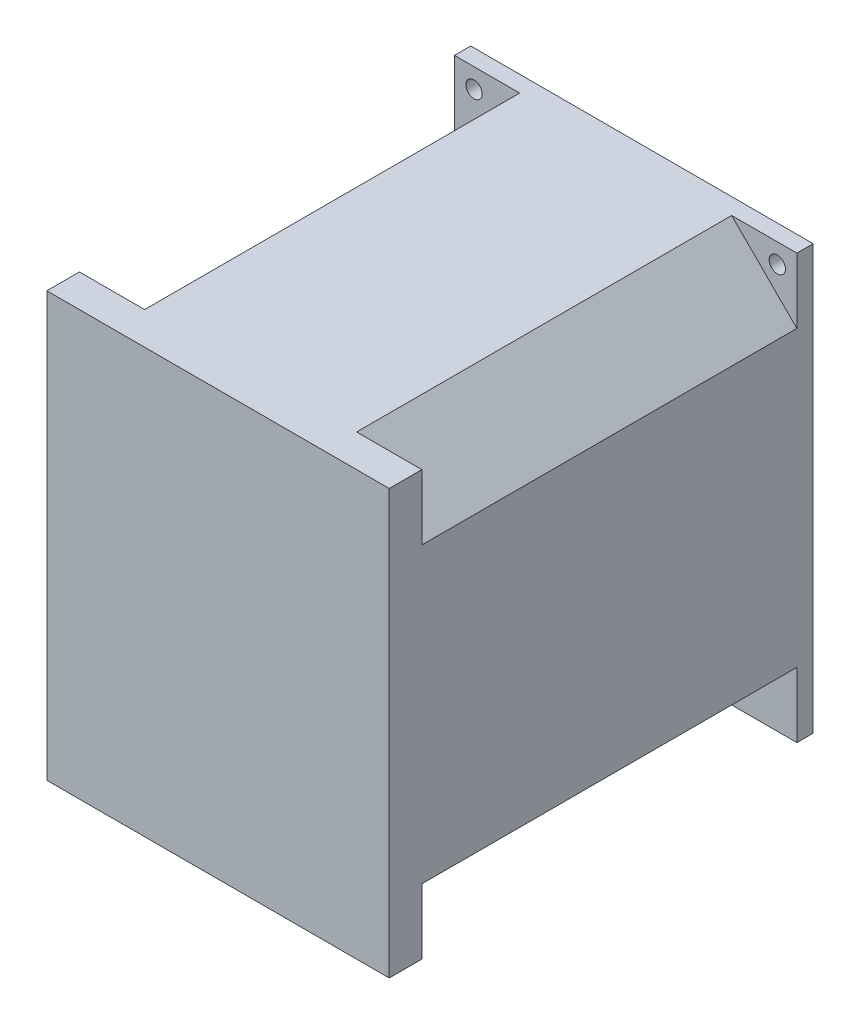
ISO-10303-21;
HEADER;
FILE_DESCRIPTION(('STEP AP214'),'2;1');
FILE_NAME('part.step','',(''),(''),'','','');
FILE_SCHEMA(('AUTOMOTIVE_DESIGN { 1 0 10303 214 1 1 1 1 }'));
ENDSEC;
DATA;
#1=APPLICATION_CONTEXT('core data for automotive mechanical design processes');
#2=APPLICATION_PROTOCOL_DEFINITION('international standard','automotive_design',2000,#1);
#3=PRODUCT_CONTEXT('',#1,'mechanical');
#4=PRODUCT('Part','Part','',(#3));
#5=PRODUCT_RELATED_PRODUCT_CATEGORY('part','',(#4));
#6=PRODUCT_DEFINITION_FORMATION('','',#4);
#7=PRODUCT_DEFINITION_CONTEXT('part definition',#1,'design');
#8=PRODUCT_DEFINITION('design','',#6,#7);
#9=PRODUCT_DEFINITION_SHAPE('','',#8);
#10=(LENGTH_UNIT() NAMED_UNIT(*) SI_UNIT(.MILLI.,.METRE.));
#11=(NAMED_UNIT(*) PLANE_ANGLE_UNIT() SI_UNIT($,.RADIAN.));
#12=(NAMED_UNIT(*) SI_UNIT($,.STERADIAN.) SOLID_ANGLE_UNIT());
#13=UNCERTAINTY_MEASURE_WITH_UNIT(LENGTH_MEASURE(1.E-05),#10,'distance_accuracy_value','');
#14=(GEOMETRIC_REPRESENTATION_CONTEXT(3) GLOBAL_UNCERTAINTY_ASSIGNED_CONTEXT((#13)) GLOBAL_UNIT_ASSIGNED_CONTEXT((#10,
#11,#12)) REPRESENTATION_CONTEXT('',''));
#15=CARTESIAN_POINT('',(0.,0.,0.));
#16=DIRECTION('',(0.,0.,1.));
#17=DIRECTION('',(1.,0.,0.));
#18=AXIS2_PLACEMENT_3D('',#15,#16,#17);
#19=CARTESIAN_POINT('',(105.,0.,0.));
#20=DIRECTION('',(0.,1.,0.));
#21=DIRECTION('',(0.,0.,1.));
#22=AXIS2_PLACEMENT_3D('',#19,#20,#21);
#23=PLANE('',#22);
#24=DIRECTION('',(1.,0.,0.));
#25=VECTOR('',#24,1.);
#26=CARTESIAN_POINT('',(85.,0.,-125.));
#27=LINE('',#26,#25);
#28=CARTESIAN_POINT('',(85.,0.,-125.));
#29=VERTEX_POINT('',#28);
#30=CARTESIAN_POINT('',(105.,0.,-125.));
#31=VERTEX_POINT('',#30);
#32=EDGE_CURVE('E222',#29,#31,#27,.T.);
#33=ORIENTED_EDGE('',*,*,#32,.F.);
#34=DIRECTION('',(0.,0.,1.));
#35=VECTOR('',#34,1.);
#36=CARTESIAN_POINT('',(85.,0.,-125.));
#37=LINE('',#36,#35);
#38=CARTESIAN_POINT('',(85.,0.,-10.));
#39=VERTEX_POINT('',#38);
#40=EDGE_CURVE('E159',#29,#39,#37,.T.);
#41=ORIENTED_EDGE('',*,*,#40,.T.);
#42=DIRECTION('',(1.,0.,0.));
#43=VECTOR('',#42,1.);
#44=CARTESIAN_POINT('',(85.,0.,-10.));
#45=LINE('',#44,#43);
#46=CARTESIAN_POINT('',(105.,0.,-10.));
#47=VERTEX_POINT('',#46);
#48=EDGE_CURVE('E149',#39,#47,#45,.T.);
#49=ORIENTED_EDGE('',*,*,#48,.T.);
#50=DIRECTION('',(0.,0.,-1.));
#51=VECTOR('',#50,1.);
#52=CARTESIAN_POINT('',(105.,0.,0.));
#53=LINE('',#52,#51);
#54=CARTESIAN_POINT('',(105.,0.,0.));
#55=VERTEX_POINT('',#54);
#56=EDGE_CURVE('E157',#55,#47,#53,.T.);
#57=ORIENTED_EDGE('',*,*,#56,.F.);
#58=DIRECTION('',(-1.,0.,0.));
#59=VECTOR('',#58,1.);
#60=CARTESIAN_POINT('',(105.,0.,0.));
#61=LINE('',#60,#59);
#62=CARTESIAN_POINT('',(0.,0.,0.));
#63=VERTEX_POINT('',#62);
#64=EDGE_CURVE('E11',#55,#63,#61,.T.);
#65=ORIENTED_EDGE('',*,*,#64,.T.);
#66=DIRECTION('',(0.,0.,-1.));
#67=VECTOR('',#66,1.);
#68=CARTESIAN_POINT('',(0.,0.,0.));
#69=LINE('',#68,#67);
#70=CARTESIAN_POINT('',(0.,0.,-10.));
#71=VERTEX_POINT('',#70);
#72=EDGE_CURVE('E203',#63,#71,#69,.T.);
#73=ORIENTED_EDGE('',*,*,#72,.T.);
#74=DIRECTION('',(1.,0.,0.));
#75=VECTOR('',#74,1.);
#76=CARTESIAN_POINT('',(0.,0.,-10.));
#77=LINE('',#76,#75);
#78=CARTESIAN_POINT('',(20.,0.,-10.));
#79=VERTEX_POINT('',#78);
#80=EDGE_CURVE('E270',#71,#79,#77,.T.);
#81=ORIENTED_EDGE('',*,*,#80,.T.);
#82=DIRECTION('',(0.,0.,1.));
#83=VECTOR('',#82,1.);
#84=CARTESIAN_POINT('',(20.,0.,-125.));
#85=LINE('',#84,#83);
#86=CARTESIAN_POINT('',(20.,0.,-125.));
#87=VERTEX_POINT('',#86);
#88=EDGE_CURVE('E283',#87,#79,#85,.T.);
#89=ORIENTED_EDGE('',*,*,#88,.F.);
#90=DIRECTION('',(1.,0.,0.));
#91=VECTOR('',#90,1.);
#92=CARTESIAN_POINT('',(0.,0.,-125.));
#93=LINE('',#92,#91);
#94=CARTESIAN_POINT('',(0.,0.,-125.));
#95=VERTEX_POINT('',#94);
#96=EDGE_CURVE('E278',#95,#87,#93,.T.);
#97=ORIENTED_EDGE('',*,*,#96,.F.);
#98=CARTESIAN_POINT('',(0.,0.,-130.));
#99=VERTEX_POINT('',#98);
#100=EDGE_CURVE('E198',#95,#99,#69,.T.);
#101=ORIENTED_EDGE('',*,*,#100,.T.);
#102=DIRECTION('',(-1.,0.,0.));
#103=VECTOR('',#102,1.);
#104=CARTESIAN_POINT('',(105.,0.,-130.));
#105=LINE('',#104,#103);
#106=CARTESIAN_POINT('',(105.,0.,-130.));
#107=VERTEX_POINT('',#106);
#108=EDGE_CURVE('E41',#107,#99,#105,.T.);
#109=ORIENTED_EDGE('',*,*,#108,.F.);
#110=EDGE_CURVE('E168',#31,#107,#53,.T.);
#111=ORIENTED_EDGE('',*,*,#110,.F.);
#112=EDGE_LOOP('',(#33,#41,#49,#57,#65,#73,#81,#89,#97,#101,#109,#111));
#113=FACE_BOUND('',#112,.T.);
#114=ADVANCED_FACE('F33',(#113),#23,.F.);
#115=CARTESIAN_POINT('',(105.,130.,0.));
#116=DIRECTION('',(-1.,0.,0.));
#117=DIRECTION('',(0.,0.,1.));
#118=AXIS2_PLACEMENT_3D('',#115,#116,#117);
#119=PLANE('',#118);
#120=DIRECTION('',(0.,1.,0.));
#121=VECTOR('',#120,1.);
#122=CARTESIAN_POINT('',(105.,0.,-125.));
#123=LINE('',#122,#121);
#124=CARTESIAN_POINT('',(105.,20.,-125.));
#125=VERTEX_POINT('',#124);
#126=EDGE_CURVE('E221',#31,#125,#123,.T.);
#127=ORIENTED_EDGE('',*,*,#126,.F.);
#128=ORIENTED_EDGE('',*,*,#110,.T.);
#129=DIRECTION('',(0.,1.,0.));
#130=VECTOR('',#129,1.);
#131=CARTESIAN_POINT('',(105.,0.,-130.));
#132=LINE('',#131,#130);
#133=CARTESIAN_POINT('',(105.,130.,-130.));
#134=VERTEX_POINT('',#133);
#135=EDGE_CURVE('E167',#107,#134,#132,.T.);
#136=ORIENTED_EDGE('',*,*,#135,.T.);
#137=DIRECTION('',(0.,0.,1.));
#138=VECTOR('',#137,1.);
#139=CARTESIAN_POINT('',(105.,130.,0.));
#140=LINE('',#139,#138);
#141=CARTESIAN_POINT('',(105.,130.,-125.));
#142=VERTEX_POINT('',#141);
#143=EDGE_CURVE('E175',#134,#142,#140,.T.);
#144=ORIENTED_EDGE('',*,*,#143,.T.);
#145=DIRECTION('',(0.,1.,0.));
#146=VECTOR('',#145,1.);
#147=CARTESIAN_POINT('',(105.,130.,-125.));
#148=LINE('',#147,#146);
#149=CARTESIAN_POINT('',(105.,110.,-125.));
#150=VERTEX_POINT('',#149);
#151=EDGE_CURVE('E220',#150,#142,#148,.T.);
#152=ORIENTED_EDGE('',*,*,#151,.F.);
#153=DIRECTION('',(0.,0.,1.));
#154=VECTOR('',#153,1.);
#155=CARTESIAN_POINT('',(105.,110.,-125.));
#156=LINE('',#155,#154);
#157=CARTESIAN_POINT('',(105.,110.,-10.));
#158=VERTEX_POINT('',#157);
#159=EDGE_CURVE('E245',#150,#158,#156,.T.);
#160=ORIENTED_EDGE('',*,*,#159,.T.);
#161=DIRECTION('',(0.,1.,0.));
#162=VECTOR('',#161,1.);
#163=CARTESIAN_POINT('',(105.,130.,-10.));
#164=LINE('',#163,#162);
#165=CARTESIAN_POINT('',(105.,130.,-10.));
#166=VERTEX_POINT('',#165);
#167=EDGE_CURVE('E237',#158,#166,#164,.T.);
#168=ORIENTED_EDGE('',*,*,#167,.T.);
#169=CARTESIAN_POINT('',(105.,130.,0.));
#170=VERTEX_POINT('',#169);
#171=EDGE_CURVE('E170',#166,#170,#140,.T.);
#172=ORIENTED_EDGE('',*,*,#171,.T.);
#173=DIRECTION('',(0.,-1.,0.));
#174=VECTOR('',#173,1.);
#175=CARTESIAN_POINT('',(105.,0.,0.));
#176=LINE('',#175,#174);
#177=EDGE_CURVE('E165',#170,#55,#176,.T.);
#178=ORIENTED_EDGE('',*,*,#177,.T.);
#179=ORIENTED_EDGE('',*,*,#56,.T.);
#180=DIRECTION('',(0.,1.,0.));
#181=VECTOR('',#180,1.);
#182=CARTESIAN_POINT('',(105.,0.,-10.));
#183=LINE('',#182,#181);
#184=CARTESIAN_POINT('',(105.,20.,-10.));
#185=VERTEX_POINT('',#184);
#186=EDGE_CURVE('E146',#47,#185,#183,.T.);
#187=ORIENTED_EDGE('',*,*,#186,.T.);
#188=DIRECTION('',(0.,0.,1.));
#189=VECTOR('',#188,1.);
#190=CARTESIAN_POINT('',(105.,20.,-125.));
#191=LINE('',#190,#189);
#192=EDGE_CURVE('E231',#125,#185,#191,.T.);
#193=ORIENTED_EDGE('',*,*,#192,.F.);
#194=EDGE_LOOP('',(#127,#128,#136,#144,#152,#160,#168,#172,#178,#179,#187,#193));
#195=FACE_BOUND('',#194,.T.);
#196=ADVANCED_FACE('F163',(#195),#119,.F.);
#197=CARTESIAN_POINT('',(0.,130.,0.));
#198=DIRECTION('',(-1.,0.,0.));
#199=DIRECTION('',(0.,0.,1.));
#200=AXIS2_PLACEMENT_3D('',#197,#198,#199);
#201=PLANE('',#200);
#202=DIRECTION('',(0.,0.,1.));
#203=VECTOR('',#202,1.);
#204=CARTESIAN_POINT('',(0.,110.,-125.));
#205=LINE('',#204,#203);
#206=CARTESIAN_POINT('',(0.,110.,-125.));
#207=VERTEX_POINT('',#206);
#208=CARTESIAN_POINT('',(0.,110.,-10.));
#209=VERTEX_POINT('',#208);
#210=EDGE_CURVE('E263',#207,#209,#205,.T.);
#211=ORIENTED_EDGE('',*,*,#210,.F.);
#212=DIRECTION('',(0.,-1.,0.));
#213=VECTOR('',#212,1.);
#214=CARTESIAN_POINT('',(0.,130.,-125.));
#215=LINE('',#214,#213);
#216=CARTESIAN_POINT('',(0.,130.,-125.));
#217=VERTEX_POINT('',#216);
#218=EDGE_CURVE('E258',#217,#207,#215,.T.);
#219=ORIENTED_EDGE('',*,*,#218,.F.);
#220=DIRECTION('',(0.,0.,1.));
#221=VECTOR('',#220,1.);
#222=CARTESIAN_POINT('',(0.,130.,0.));
#223=LINE('',#222,#221);
#224=CARTESIAN_POINT('',(0.,130.,-130.));
#225=VERTEX_POINT('',#224);
#226=EDGE_CURVE('E201',#225,#217,#223,.T.);
#227=ORIENTED_EDGE('',*,*,#226,.F.);
#228=DIRECTION('',(0.,1.,0.));
#229=VECTOR('',#228,1.);
#230=CARTESIAN_POINT('',(0.,0.,-130.));
#231=LINE('',#230,#229);
#232=EDGE_CURVE('E190',#99,#225,#231,.T.);
#233=ORIENTED_EDGE('',*,*,#232,.F.);
#234=ORIENTED_EDGE('',*,*,#100,.F.);
#235=DIRECTION('',(0.,-1.,0.));
#236=VECTOR('',#235,1.);
#237=CARTESIAN_POINT('',(0.,20.,-125.));
#238=LINE('',#237,#236);
#239=CARTESIAN_POINT('',(0.,20.,-125.));
#240=VERTEX_POINT('',#239);
#241=EDGE_CURVE('E276',#240,#95,#238,.T.);
#242=ORIENTED_EDGE('',*,*,#241,.F.);
#243=DIRECTION('',(0.,0.,1.));
#244=VECTOR('',#243,1.);
#245=CARTESIAN_POINT('',(0.,20.,-125.));
#246=LINE('',#245,#244);
#247=CARTESIAN_POINT('',(0.,20.,-10.));
#248=VERTEX_POINT('',#247);
#249=EDGE_CURVE('E284',#240,#248,#246,.T.);
#250=ORIENTED_EDGE('',*,*,#249,.T.);
#251=DIRECTION('',(0.,-1.,0.));
#252=VECTOR('',#251,1.);
#253=CARTESIAN_POINT('',(0.,20.,-10.));
#254=LINE('',#253,#252);
#255=EDGE_CURVE('E266',#248,#71,#254,.T.);
#256=ORIENTED_EDGE('',*,*,#255,.T.);
#257=ORIENTED_EDGE('',*,*,#72,.F.);
#258=DIRECTION('',(0.,-1.,0.));
#259=VECTOR('',#258,1.);
#260=CARTESIAN_POINT('',(0.,0.,0.));
#261=LINE('',#260,#259);
#262=CARTESIAN_POINT('',(0.,130.,0.));
#263=VERTEX_POINT('',#262);
#264=EDGE_CURVE('E287',#263,#63,#261,.T.);
#265=ORIENTED_EDGE('',*,*,#264,.F.);
#266=CARTESIAN_POINT('',(0.,130.,-10.));
#267=VERTEX_POINT('',#266);
#268=EDGE_CURVE('E202',#267,#263,#223,.T.);
#269=ORIENTED_EDGE('',*,*,#268,.F.);
#270=DIRECTION('',(0.,-1.,0.));
#271=VECTOR('',#270,1.);
#272=CARTESIAN_POINT('',(0.,130.,-10.));
#273=LINE('',#272,#271);
#274=EDGE_CURVE('E251',#267,#209,#273,.T.);
#275=ORIENTED_EDGE('',*,*,#274,.T.);
#276=EDGE_LOOP('',(#211,#219,#227,#233,#234,#242,#250,#256,#257,#265,#269,#275));
#277=FACE_BOUND('',#276,.T.);
#278=ADVANCED_FACE('F196',(#277),#201,.T.);
#279=CARTESIAN_POINT('',(105.,130.,0.));
#280=DIRECTION('',(0.,-1.,0.));
#281=DIRECTION('',(0.,0.,-1.));
#282=AXIS2_PLACEMENT_3D('',#279,#280,#281);
#283=PLANE('',#282);
#284=DIRECTION('',(0.,0.,1.));
#285=VECTOR('',#284,1.);
#286=CARTESIAN_POINT('',(85.,130.,-125.));
#287=LINE('',#286,#285);
#288=CARTESIAN_POINT('',(85.,130.,-125.));
#289=VERTEX_POINT('',#288);
#290=CARTESIAN_POINT('',(85.,130.,-10.));
#291=VERTEX_POINT('',#290);
#292=EDGE_CURVE('E244',#289,#291,#287,.T.);
#293=ORIENTED_EDGE('',*,*,#292,.F.);
#294=DIRECTION('',(-1.,0.,0.));
#295=VECTOR('',#294,1.);
#296=CARTESIAN_POINT('',(85.,130.,-125.));
#297=LINE('',#296,#295);
#298=EDGE_CURVE('E217',#142,#289,#297,.T.);
#299=ORIENTED_EDGE('',*,*,#298,.F.);
#300=ORIENTED_EDGE('',*,*,#143,.F.);
#301=DIRECTION('',(-1.,0.,0.));
#302=VECTOR('',#301,1.);
#303=CARTESIAN_POINT('',(105.,130.,-130.));
#304=LINE('',#303,#302);
#305=EDGE_CURVE('E181',#134,#225,#304,.T.);
#306=ORIENTED_EDGE('',*,*,#305,.T.);
#307=ORIENTED_EDGE('',*,*,#226,.T.);
#308=DIRECTION('',(-1.,0.,0.));
#309=VECTOR('',#308,1.);
#310=CARTESIAN_POINT('',(20.,130.,-125.));
#311=LINE('',#310,#309);
#312=CARTESIAN_POINT('',(20.,130.,-125.));
#313=VERTEX_POINT('',#312);
#314=EDGE_CURVE('E213',#313,#217,#311,.T.);
#315=ORIENTED_EDGE('',*,*,#314,.F.);
#316=DIRECTION('',(0.,0.,1.));
#317=VECTOR('',#316,1.);
#318=CARTESIAN_POINT('',(20.,130.,-125.));
#319=LINE('',#318,#317);
#320=CARTESIAN_POINT('',(20.,130.,-10.));
#321=VERTEX_POINT('',#320);
#322=EDGE_CURVE('E264',#313,#321,#319,.T.);
#323=ORIENTED_EDGE('',*,*,#322,.T.);
#324=DIRECTION('',(-1.,0.,0.));
#325=VECTOR('',#324,1.);
#326=CARTESIAN_POINT('',(20.,130.,-10.));
#327=LINE('',#326,#325);
#328=EDGE_CURVE('E247',#321,#267,#327,.T.);
#329=ORIENTED_EDGE('',*,*,#328,.T.);
#330=ORIENTED_EDGE('',*,*,#268,.T.);
#331=DIRECTION('',(-1.,0.,0.));
#332=VECTOR('',#331,1.);
#333=CARTESIAN_POINT('',(105.,130.,0.));
#334=LINE('',#333,#332);
#335=EDGE_CURVE('E178',#170,#263,#334,.T.);
#336=ORIENTED_EDGE('',*,*,#335,.F.);
#337=ORIENTED_EDGE('',*,*,#171,.F.);
#338=DIRECTION('',(-1.,0.,0.));
#339=VECTOR('',#338,1.);
#340=CARTESIAN_POINT('',(85.,130.,-10.));
#341=LINE('',#340,#339);
#342=EDGE_CURVE('E56',#166,#291,#341,.T.);
#343=ORIENTED_EDGE('',*,*,#342,.T.);
#344=EDGE_LOOP('',(#293,#299,#300,#306,#307,#315,#323,#329,#330,#336,#337,#343));
#345=FACE_BOUND('',#344,.T.);
#346=ADVANCED_FACE('F211',(#345),#283,.F.);
#347=CARTESIAN_POINT('',(105.,0.,0.));
#348=DIRECTION('',(0.,0.,-1.));
#349=DIRECTION('',(-1.,0.,0.));
#350=AXIS2_PLACEMENT_3D('',#347,#348,#349);
#351=PLANE('',#350);
#352=ORIENTED_EDGE('',*,*,#264,.T.);
#353=ORIENTED_EDGE('',*,*,#64,.F.);
#354=ORIENTED_EDGE('',*,*,#177,.F.);
#355=ORIENTED_EDGE('',*,*,#335,.T.);
#356=EDGE_LOOP('',(#352,#353,#354,#355));
#357=FACE_BOUND('',#356,.T.);
#358=ADVANCED_FACE('F35',(#357),#351,.F.);
#359=CARTESIAN_POINT('',(105.,0.,-130.));
#360=DIRECTION('',(0.,0.,1.));
#361=DIRECTION('',(1.,0.,0.));
#362=AXIS2_PLACEMENT_3D('',#359,#360,#361);
#363=PLANE('',#362);
#364=CARTESIAN_POINT('',(99.,124.,-130.));
#365=DIRECTION('',(0.,0.,-1.));
#366=DIRECTION('',(-1.,0.,0.));
#367=AXIS2_PLACEMENT_3D('',#364,#365,#366);
#368=CIRCLE('',#367,2.50000000000001);
#369=CARTESIAN_POINT('',(96.5,124.,-130.));
#370=VERTEX_POINT('',#369);
#371=EDGE_CURVE('E444',#370,#370,#368,.T.);
#372=ORIENTED_EDGE('',*,*,#371,.F.);
#373=EDGE_LOOP('',(#372));
#374=FACE_BOUND('',#373,.T.);
#375=CARTESIAN_POINT('',(6.,124.,-130.));
#376=DIRECTION('',(0.,0.,-1.));
#377=DIRECTION('',(-1.,0.,0.));
#378=AXIS2_PLACEMENT_3D('',#375,#376,#377);
#379=CIRCLE('',#378,2.50000000000001);
#380=CARTESIAN_POINT('',(3.49999999999999,124.,-130.));
#381=VERTEX_POINT('',#380);
#382=EDGE_CURVE('E446',#381,#381,#379,.T.);
#383=ORIENTED_EDGE('',*,*,#382,.F.);
#384=EDGE_LOOP('',(#383));
#385=FACE_BOUND('',#384,.T.);
#386=ORIENTED_EDGE('',*,*,#232,.T.);
#387=ORIENTED_EDGE('',*,*,#305,.F.);
#388=ORIENTED_EDGE('',*,*,#135,.F.);
#389=ORIENTED_EDGE('',*,*,#108,.T.);
#390=EDGE_LOOP('',(#386,#387,#388,#389));
#391=FACE_BOUND('',#390,.T.);
#392=ADVANCED_FACE('F188',(#374,#385,#391),#363,.F.);
#393=CARTESIAN_POINT('',(20.,0.,-125.));
#394=DIRECTION('',(0.707106781186547,0.707106781186547,0.));
#395=DIRECTION('',(-0.707106781186548,0.707106781186548,0.));
#396=AXIS2_PLACEMENT_3D('',#393,#394,#395);
#397=PLANE('',#396);
#398=DIRECTION('',(-0.707106781186548,0.707106781186548,0.));
#399=VECTOR('',#398,1.);
#400=CARTESIAN_POINT('',(20.,0.,-10.));
#401=LINE('',#400,#399);
#402=EDGE_CURVE('E273',#79,#248,#401,.T.);
#403=ORIENTED_EDGE('',*,*,#402,.T.);
#404=ORIENTED_EDGE('',*,*,#249,.F.);
#405=DIRECTION('',(-0.707106781186548,0.707106781186548,0.));
#406=VECTOR('',#405,1.);
#407=CARTESIAN_POINT('',(20.,0.,-125.));
#408=LINE('',#407,#406);
#409=EDGE_CURVE('E280',#87,#240,#408,.T.);
#410=ORIENTED_EDGE('',*,*,#409,.F.);
#411=ORIENTED_EDGE('',*,*,#88,.T.);
#412=EDGE_LOOP('',(#403,#404,#410,#411));
#413=FACE_BOUND('',#412,.T.);
#414=ADVANCED_FACE('F297',(#413),#397,.F.);
#415=CARTESIAN_POINT('',(0.,0.,-125.));
#416=DIRECTION('',(0.,0.,1.));
#417=DIRECTION('',(1.,0.,0.));
#418=AXIS2_PLACEMENT_3D('',#415,#416,#417);
#419=PLANE('',#418);
#420=ORIENTED_EDGE('',*,*,#241,.T.);
#421=ORIENTED_EDGE('',*,*,#96,.T.);
#422=ORIENTED_EDGE('',*,*,#409,.T.);
#423=EDGE_LOOP('',(#420,#421,#422));
#424=FACE_BOUND('',#423,.T.);
#425=ADVANCED_FACE('F295',(#424),#419,.T.);
#426=CARTESIAN_POINT('',(0.,0.,-10.));
#427=DIRECTION('',(0.,0.,1.));
#428=DIRECTION('',(1.,0.,0.));
#429=AXIS2_PLACEMENT_3D('',#426,#427,#428);
#430=PLANE('',#429);
#431=ORIENTED_EDGE('',*,*,#255,.F.);
#432=ORIENTED_EDGE('',*,*,#402,.F.);
#433=ORIENTED_EDGE('',*,*,#80,.F.);
#434=EDGE_LOOP('',(#431,#432,#433));
#435=FACE_BOUND('',#434,.T.);
#436=ADVANCED_FACE('F320',(#435),#430,.F.);
#437=CARTESIAN_POINT('',(0.,110.,-125.));
#438=DIRECTION('',(0.707106781186547,-0.707106781186548,0.));
#439=DIRECTION('',(0.707106781186548,0.707106781186547,0.));
#440=AXIS2_PLACEMENT_3D('',#437,#438,#439);
#441=PLANE('',#440);
#442=DIRECTION('',(0.707106781186548,0.707106781186547,0.));
#443=VECTOR('',#442,1.);
#444=CARTESIAN_POINT('',(0.,110.,-10.));
#445=LINE('',#444,#443);
#446=EDGE_CURVE('E254',#209,#321,#445,.T.);
#447=ORIENTED_EDGE('',*,*,#446,.T.);
#448=ORIENTED_EDGE('',*,*,#322,.F.);
#449=DIRECTION('',(0.707106781186548,0.707106781186547,0.));
#450=VECTOR('',#449,1.);
#451=CARTESIAN_POINT('',(0.,110.,-125.));
#452=LINE('',#451,#450);
#453=EDGE_CURVE('E260',#207,#313,#452,.T.);
#454=ORIENTED_EDGE('',*,*,#453,.F.);
#455=ORIENTED_EDGE('',*,*,#210,.T.);
#456=EDGE_LOOP('',(#447,#448,#454,#455));
#457=FACE_BOUND('',#456,.T.);
#458=ADVANCED_FACE('F307',(#457),#441,.F.);
#459=CARTESIAN_POINT('',(0.,130.,-125.));
#460=DIRECTION('',(0.,0.,1.));
#461=DIRECTION('',(1.,0.,0.));
#462=AXIS2_PLACEMENT_3D('',#459,#460,#461);
#463=PLANE('',#462);
#464=CARTESIAN_POINT('',(6.,124.,-125.));
#465=DIRECTION('',(0.,0.,-1.));
#466=DIRECTION('',(-1.,0.,0.));
#467=AXIS2_PLACEMENT_3D('',#464,#465,#466);
#468=CIRCLE('',#467,2.50000000000001);
#469=CARTESIAN_POINT('',(3.49999999999999,124.,-125.));
#470=VERTEX_POINT('',#469);
#471=EDGE_CURVE('E160',#470,#470,#468,.T.);
#472=ORIENTED_EDGE('',*,*,#471,.T.);
#473=EDGE_LOOP('',(#472));
#474=FACE_BOUND('',#473,.T.);
#475=ORIENTED_EDGE('',*,*,#314,.T.);
#476=ORIENTED_EDGE('',*,*,#218,.T.);
#477=ORIENTED_EDGE('',*,*,#453,.T.);
#478=EDGE_LOOP('',(#475,#476,#477));
#479=FACE_BOUND('',#478,.T.);
#480=ADVANCED_FACE('F310',(#474,#479),#463,.T.);
#481=CARTESIAN_POINT('',(0.,130.,-10.));
#482=DIRECTION('',(0.,0.,1.));
#483=DIRECTION('',(1.,0.,0.));
#484=AXIS2_PLACEMENT_3D('',#481,#482,#483);
#485=PLANE('',#484);
#486=ORIENTED_EDGE('',*,*,#328,.F.);
#487=ORIENTED_EDGE('',*,*,#446,.F.);
#488=ORIENTED_EDGE('',*,*,#274,.F.);
#489=EDGE_LOOP('',(#486,#487,#488));
#490=FACE_BOUND('',#489,.T.);
#491=ADVANCED_FACE('F305',(#490),#485,.F.);
#492=CARTESIAN_POINT('',(105.,110.,-125.));
#493=DIRECTION('',(-0.707106781186548,-0.707106781186547,0.));
#494=DIRECTION('',(0.707106781186547,-0.707106781186548,0.));
#495=AXIS2_PLACEMENT_3D('',#492,#493,#494);
#496=PLANE('',#495);
#497=DIRECTION('',(0.707106781186547,-0.707106781186548,0.));
#498=VECTOR('',#497,1.);
#499=CARTESIAN_POINT('',(105.,110.,-10.));
#500=LINE('',#499,#498);
#501=EDGE_CURVE('E235',#291,#158,#500,.T.);
#502=ORIENTED_EDGE('',*,*,#501,.T.);
#503=ORIENTED_EDGE('',*,*,#159,.F.);
#504=DIRECTION('',(0.707106781186547,-0.707106781186548,0.));
#505=VECTOR('',#504,1.);
#506=CARTESIAN_POINT('',(105.,110.,-125.));
#507=LINE('',#506,#505);
#508=EDGE_CURVE('E240',#289,#150,#507,.T.);
#509=ORIENTED_EDGE('',*,*,#508,.F.);
#510=ORIENTED_EDGE('',*,*,#292,.T.);
#511=EDGE_LOOP('',(#502,#503,#509,#510));
#512=FACE_BOUND('',#511,.T.);
#513=ADVANCED_FACE('F318',(#512),#496,.F.);
#514=CARTESIAN_POINT('',(105.,130.,-125.));
#515=DIRECTION('',(0.,0.,-1.));
#516=DIRECTION('',(-1.,0.,0.));
#517=AXIS2_PLACEMENT_3D('',#514,#515,#516);
#518=PLANE('',#517);
#519=CARTESIAN_POINT('',(99.,124.,-125.));
#520=DIRECTION('',(0.,0.,-1.));
#521=DIRECTION('',(-1.,0.,0.));
#522=AXIS2_PLACEMENT_3D('',#519,#520,#521);
#523=CIRCLE('',#522,2.50000000000001);
#524=CARTESIAN_POINT('',(96.5,124.,-125.));
#525=VERTEX_POINT('',#524);
#526=EDGE_CURVE('E441',#525,#525,#523,.T.);
#527=ORIENTED_EDGE('',*,*,#526,.T.);
#528=EDGE_LOOP('',(#527));
#529=FACE_BOUND('',#528,.T.);
#530=ORIENTED_EDGE('',*,*,#298,.T.);
#531=ORIENTED_EDGE('',*,*,#508,.T.);
#532=ORIENTED_EDGE('',*,*,#151,.T.);
#533=EDGE_LOOP('',(#530,#531,#532));
#534=FACE_BOUND('',#533,.T.);
#535=ADVANCED_FACE('F368',(#529,#534),#518,.F.);
#536=CARTESIAN_POINT('',(105.,130.,-10.));
#537=DIRECTION('',(0.,0.,-1.));
#538=DIRECTION('',(-1.,0.,0.));
#539=AXIS2_PLACEMENT_3D('',#536,#537,#538);
#540=PLANE('',#539);
#541=ORIENTED_EDGE('',*,*,#342,.F.);
#542=ORIENTED_EDGE('',*,*,#167,.F.);
#543=ORIENTED_EDGE('',*,*,#501,.F.);
#544=EDGE_LOOP('',(#541,#542,#543));
#545=FACE_BOUND('',#544,.T.);
#546=ADVANCED_FACE('F378',(#545),#540,.T.);
#547=CARTESIAN_POINT('',(105.,20.,-125.));
#548=DIRECTION('',(-0.707106781186547,0.707106781186547,0.));
#549=DIRECTION('',(-0.707106781186548,-0.707106781186548,0.));
#550=AXIS2_PLACEMENT_3D('',#547,#548,#549);
#551=PLANE('',#550);
#552=DIRECTION('',(-0.707106781186548,-0.707106781186548,0.));
#553=VECTOR('',#552,1.);
#554=CARTESIAN_POINT('',(105.,20.,-10.));
#555=LINE('',#554,#553);
#556=EDGE_CURVE('E48',#185,#39,#555,.T.);
#557=ORIENTED_EDGE('',*,*,#556,.T.);
#558=ORIENTED_EDGE('',*,*,#40,.F.);
#559=DIRECTION('',(-0.707106781186548,-0.707106781186548,0.));
#560=VECTOR('',#559,1.);
#561=CARTESIAN_POINT('',(105.,20.,-125.));
#562=LINE('',#561,#560);
#563=EDGE_CURVE('E226',#125,#29,#562,.T.);
#564=ORIENTED_EDGE('',*,*,#563,.F.);
#565=ORIENTED_EDGE('',*,*,#192,.T.);
#566=EDGE_LOOP('',(#557,#558,#564,#565));
#567=FACE_BOUND('',#566,.T.);
#568=ADVANCED_FACE('F388',(#567),#551,.F.);
#569=CARTESIAN_POINT('',(105.,0.,-125.));
#570=DIRECTION('',(0.,0.,1.));
#571=DIRECTION('',(1.,0.,0.));
#572=AXIS2_PLACEMENT_3D('',#569,#570,#571);
#573=PLANE('',#572);
#574=ORIENTED_EDGE('',*,*,#32,.T.);
#575=ORIENTED_EDGE('',*,*,#126,.T.);
#576=ORIENTED_EDGE('',*,*,#563,.T.);
#577=EDGE_LOOP('',(#574,#575,#576));
#578=FACE_BOUND('',#577,.T.);
#579=ADVANCED_FACE('F397',(#578),#573,.T.);
#580=CARTESIAN_POINT('',(105.,0.,-10.));
#581=DIRECTION('',(0.,0.,1.));
#582=DIRECTION('',(1.,0.,0.));
#583=AXIS2_PLACEMENT_3D('',#580,#581,#582);
#584=PLANE('',#583);
#585=ORIENTED_EDGE('',*,*,#48,.F.);
#586=ORIENTED_EDGE('',*,*,#556,.F.);
#587=ORIENTED_EDGE('',*,*,#186,.F.);
#588=EDGE_LOOP('',(#585,#586,#587));
#589=FACE_BOUND('',#588,.T.);
#590=ADVANCED_FACE('F148',(#589),#584,.F.);
#591=CARTESIAN_POINT('',(6.,124.,-125.));
#592=DIRECTION('',(0.,0.,-1.));
#593=DIRECTION('',(-1.,0.,0.));
#594=AXIS2_PLACEMENT_3D('',#591,#592,#593);
#595=CYLINDRICAL_SURFACE('',#594,2.50000000000001);
#596=ORIENTED_EDGE('',*,*,#471,.F.);
#597=EDGE_LOOP('',(#596));
#598=FACE_BOUND('',#597,.T.);
#599=ORIENTED_EDGE('',*,*,#382,.T.);
#600=EDGE_LOOP('',(#599));
#601=FACE_BOUND('',#600,.T.);
#602=ADVANCED_FACE('F415',(#598,#601),#595,.F.);
#603=CARTESIAN_POINT('',(99.,124.,-125.));
#604=DIRECTION('',(0.,0.,-1.));
#605=DIRECTION('',(-1.,0.,0.));
#606=AXIS2_PLACEMENT_3D('',#603,#604,#605);
#607=CYLINDRICAL_SURFACE('',#606,2.50000000000001);
#608=ORIENTED_EDGE('',*,*,#526,.F.);
#609=EDGE_LOOP('',(#608));
#610=FACE_BOUND('',#609,.T.);
#611=ORIENTED_EDGE('',*,*,#371,.T.);
#612=EDGE_LOOP('',(#611));
#613=FACE_BOUND('',#612,.T.);
#614=ADVANCED_FACE('F424',(#610,#613),#607,.F.);
#615=CLOSED_SHELL('',(#114,#196,#278,#346,#358,#392,#414,#425,#436,#458,#480,#491,#513,#535,
#546,#568,#579,#590,#602,#614));
#616=MANIFOLD_SOLID_BREP('B2',#615);
#617=ADVANCED_BREP_SHAPE_REPRESENTATION('',(#18,#616),#14);
#618=SHAPE_DEFINITION_REPRESENTATION(#9,#617);
ENDSEC;
END-ISO-10303-21;
